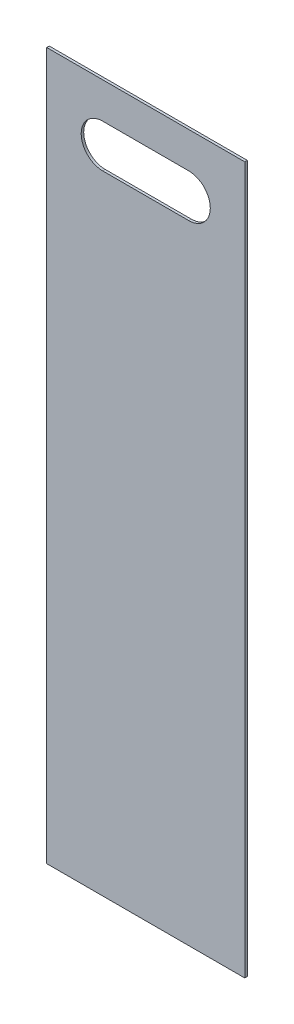
ISO-10303-21;
HEADER;
FILE_DESCRIPTION(('STEP AP214'),'2;1');
FILE_NAME('part.step','',(''),(''),'','','');
FILE_SCHEMA(('AUTOMOTIVE_DESIGN { 1 0 10303 214 1 1 1 1 }'));
ENDSEC;
DATA;
#1=APPLICATION_CONTEXT('core data for automotive mechanical design processes');
#2=APPLICATION_PROTOCOL_DEFINITION('international standard','automotive_design',2000,#1);
#3=PRODUCT_CONTEXT('',#1,'mechanical');
#4=PRODUCT('Part','Part','',(#3));
#5=PRODUCT_RELATED_PRODUCT_CATEGORY('part','',(#4));
#6=PRODUCT_DEFINITION_FORMATION('','',#4);
#7=PRODUCT_DEFINITION_CONTEXT('part definition',#1,'design');
#8=PRODUCT_DEFINITION('design','',#6,#7);
#9=PRODUCT_DEFINITION_SHAPE('','',#8);
#10=(LENGTH_UNIT() NAMED_UNIT(*) SI_UNIT(.MILLI.,.METRE.));
#11=(NAMED_UNIT(*) PLANE_ANGLE_UNIT() SI_UNIT($,.RADIAN.));
#12=(NAMED_UNIT(*) SI_UNIT($,.STERADIAN.) SOLID_ANGLE_UNIT());
#13=UNCERTAINTY_MEASURE_WITH_UNIT(LENGTH_MEASURE(1.E-05),#10,'distance_accuracy_value','');
#14=(GEOMETRIC_REPRESENTATION_CONTEXT(3) GLOBAL_UNCERTAINTY_ASSIGNED_CONTEXT((#13)) GLOBAL_UNIT_ASSIGNED_CONTEXT((#10,
#11,#12)) REPRESENTATION_CONTEXT('',''));
#15=CARTESIAN_POINT('',(0.,0.,0.));
#16=DIRECTION('',(0.,0.,1.));
#17=DIRECTION('',(1.,0.,0.));
#18=AXIS2_PLACEMENT_3D('',#15,#16,#17);
#19=CARTESIAN_POINT('',(0.,0.,0.2794));
#20=DIRECTION('',(0.,0.,-1.));
#21=DIRECTION('',(-1.,0.,0.));
#22=AXIS2_PLACEMENT_3D('',#19,#20,#21);
#23=PLANE('',#22);
#24=DIRECTION('',(0.,-1.,0.));
#25=VECTOR('',#24,1.);
#26=CARTESIAN_POINT('',(-10.9601,32.766,0.2794));
#27=LINE('',#26,#25);
#28=CARTESIAN_POINT('',(-10.9601,45.466,0.2794));
#29=VERTEX_POINT('',#28);
#30=CARTESIAN_POINT('',(-10.9601,-32.766,0.2794));
#31=VERTEX_POINT('',#30);
#32=EDGE_CURVE('E153',#29,#31,#27,.T.);
#33=ORIENTED_EDGE('',*,*,#32,.T.);
#34=DIRECTION('',(1.,0.,0.));
#35=VECTOR('',#34,1.);
#36=CARTESIAN_POINT('',(10.9601,-32.766,0.2794));
#37=LINE('',#36,#35);
#38=CARTESIAN_POINT('',(10.9601,-32.766,0.2794));
#39=VERTEX_POINT('',#38);
#40=EDGE_CURVE('E157',#31,#39,#37,.T.);
#41=ORIENTED_EDGE('',*,*,#40,.T.);
#42=DIRECTION('',(0.,1.,0.));
#43=VECTOR('',#42,1.);
#44=CARTESIAN_POINT('',(10.9601,32.766,0.2794));
#45=LINE('',#44,#43);
#46=CARTESIAN_POINT('',(10.9601,45.466,0.2794));
#47=VERTEX_POINT('',#46);
#48=EDGE_CURVE('E161',#39,#47,#45,.T.);
#49=ORIENTED_EDGE('',*,*,#48,.T.);
#50=DIRECTION('',(-1.,0.,0.));
#51=VECTOR('',#50,1.);
#52=CARTESIAN_POINT('',(-10.9601,45.466,0.2794));
#53=LINE('',#52,#51);
#54=EDGE_CURVE('E164',#47,#29,#53,.T.);
#55=ORIENTED_EDGE('',*,*,#54,.T.);
#56=EDGE_LOOP('',(#33,#41,#49,#55));
#57=FACE_BOUND('',#56,.T.);
#58=CARTESIAN_POINT('',(4.7625,39.116,0.2794));
#59=DIRECTION('',(0.,0.,1.));
#60=DIRECTION('',(1.,0.,0.));
#61=AXIS2_PLACEMENT_3D('',#58,#59,#60);
#62=CIRCLE('',#61,2.38125);
#63=CARTESIAN_POINT('',(4.7625,36.73475,0.2794));
#64=VERTEX_POINT('',#63);
#65=CARTESIAN_POINT('',(4.7625,41.49725,0.2794));
#66=VERTEX_POINT('',#65);
#67=EDGE_CURVE('E105',#64,#66,#62,.T.);
#68=ORIENTED_EDGE('',*,*,#67,.F.);
#69=DIRECTION('',(1.,0.,0.));
#70=VECTOR('',#69,1.);
#71=CARTESIAN_POINT('',(4.7625,36.73475,0.2794));
#72=LINE('',#71,#70);
#73=CARTESIAN_POINT('',(-4.7625,36.73475,0.2794));
#74=VERTEX_POINT('',#73);
#75=EDGE_CURVE('E131',#74,#64,#72,.T.);
#76=ORIENTED_EDGE('',*,*,#75,.F.);
#77=CARTESIAN_POINT('',(-4.7625,39.116,0.2794));
#78=DIRECTION('',(0.,0.,1.));
#79=DIRECTION('',(1.,0.,0.));
#80=AXIS2_PLACEMENT_3D('',#77,#78,#79);
#81=CIRCLE('',#80,2.38125);
#82=CARTESIAN_POINT('',(-4.7625,41.49725,0.2794));
#83=VERTEX_POINT('',#82);
#84=EDGE_CURVE('E127',#83,#74,#81,.T.);
#85=ORIENTED_EDGE('',*,*,#84,.F.);
#86=DIRECTION('',(-1.,0.,0.));
#87=VECTOR('',#86,1.);
#88=CARTESIAN_POINT('',(4.7625,41.49725,0.2794));
#89=LINE('',#88,#87);
#90=EDGE_CURVE('E114',#66,#83,#89,.T.);
#91=ORIENTED_EDGE('',*,*,#90,.F.);
#92=EDGE_LOOP('',(#68,#76,#85,#91));
#93=FACE_BOUND('',#92,.T.);
#94=ADVANCED_FACE('F39',(#57,#93),#23,.F.);
#95=CARTESIAN_POINT('',(0.,0.,0.));
#96=DIRECTION('',(0.,0.,-1.));
#97=DIRECTION('',(-1.,0.,0.));
#98=AXIS2_PLACEMENT_3D('',#95,#96,#97);
#99=PLANE('',#98);
#100=DIRECTION('',(1.,0.,0.));
#101=VECTOR('',#100,1.);
#102=CARTESIAN_POINT('',(10.9601,-32.766,0.));
#103=LINE('',#102,#101);
#104=CARTESIAN_POINT('',(-10.9601,-32.766,0.));
#105=VERTEX_POINT('',#104);
#106=CARTESIAN_POINT('',(10.9601,-32.766,0.));
#107=VERTEX_POINT('',#106);
#108=EDGE_CURVE('E123',#105,#107,#103,.T.);
#109=ORIENTED_EDGE('',*,*,#108,.F.);
#110=DIRECTION('',(0.,-1.,0.));
#111=VECTOR('',#110,1.);
#112=CARTESIAN_POINT('',(-10.9601,32.766,0.));
#113=LINE('',#112,#111);
#114=CARTESIAN_POINT('',(-10.9601,45.466,0.));
#115=VERTEX_POINT('',#114);
#116=EDGE_CURVE('E158',#115,#105,#113,.T.);
#117=ORIENTED_EDGE('',*,*,#116,.F.);
#118=DIRECTION('',(-1.,0.,0.));
#119=VECTOR('',#118,1.);
#120=CARTESIAN_POINT('',(-10.9601,45.466,0.));
#121=LINE('',#120,#119);
#122=CARTESIAN_POINT('',(10.9601,45.466,0.));
#123=VERTEX_POINT('',#122);
#124=EDGE_CURVE('E175',#123,#115,#121,.T.);
#125=ORIENTED_EDGE('',*,*,#124,.F.);
#126=DIRECTION('',(0.,1.,0.));
#127=VECTOR('',#126,1.);
#128=CARTESIAN_POINT('',(10.9601,45.466,0.));
#129=LINE('',#128,#127);
#130=EDGE_CURVE('E172',#107,#123,#129,.T.);
#131=ORIENTED_EDGE('',*,*,#130,.F.);
#132=EDGE_LOOP('',(#109,#117,#125,#131));
#133=FACE_BOUND('',#132,.T.);
#134=DIRECTION('',(1.,0.,0.));
#135=VECTOR('',#134,1.);
#136=CARTESIAN_POINT('',(4.7625,36.73475,0.));
#137=LINE('',#136,#135);
#138=CARTESIAN_POINT('',(-4.7625,36.73475,0.));
#139=VERTEX_POINT('',#138);
#140=CARTESIAN_POINT('',(4.7625,36.73475,0.));
#141=VERTEX_POINT('',#140);
#142=EDGE_CURVE('E115',#139,#141,#137,.T.);
#143=ORIENTED_EDGE('',*,*,#142,.T.);
#144=CARTESIAN_POINT('',(4.7625,39.116,0.));
#145=DIRECTION('',(0.,0.,1.));
#146=DIRECTION('',(1.,0.,0.));
#147=AXIS2_PLACEMENT_3D('',#144,#145,#146);
#148=CIRCLE('',#147,2.38125);
#149=CARTESIAN_POINT('',(4.7625,41.49725,0.));
#150=VERTEX_POINT('',#149);
#151=EDGE_CURVE('E63',#141,#150,#148,.T.);
#152=ORIENTED_EDGE('',*,*,#151,.T.);
#153=DIRECTION('',(-1.,0.,0.));
#154=VECTOR('',#153,1.);
#155=CARTESIAN_POINT('',(4.7625,41.49725,0.));
#156=LINE('',#155,#154);
#157=CARTESIAN_POINT('',(-4.7625,41.49725,0.));
#158=VERTEX_POINT('',#157);
#159=EDGE_CURVE('E121',#150,#158,#156,.T.);
#160=ORIENTED_EDGE('',*,*,#159,.T.);
#161=CARTESIAN_POINT('',(-4.7625,39.116,0.));
#162=DIRECTION('',(0.,0.,1.));
#163=DIRECTION('',(1.,0.,0.));
#164=AXIS2_PLACEMENT_3D('',#161,#162,#163);
#165=CIRCLE('',#164,2.38125);
#166=EDGE_CURVE('E140',#158,#139,#165,.T.);
#167=ORIENTED_EDGE('',*,*,#166,.T.);
#168=EDGE_LOOP('',(#143,#152,#160,#167));
#169=FACE_BOUND('',#168,.T.);
#170=ADVANCED_FACE('F198',(#133,#169),#99,.T.);
#171=CARTESIAN_POINT('',(10.9601,-32.766,0.2794));
#172=DIRECTION('',(0.,1.,0.));
#173=DIRECTION('',(-1.,0.,0.));
#174=AXIS2_PLACEMENT_3D('',#171,#172,#173);
#175=PLANE('',#174);
#176=ORIENTED_EDGE('',*,*,#108,.T.);
#177=DIRECTION('',(0.,0.,-1.));
#178=VECTOR('',#177,1.);
#179=CARTESIAN_POINT('',(10.9601,-32.766,0.2794));
#180=LINE('',#179,#178);
#181=EDGE_CURVE('E48',#39,#107,#180,.T.);
#182=ORIENTED_EDGE('',*,*,#181,.F.);
#183=ORIENTED_EDGE('',*,*,#40,.F.);
#184=DIRECTION('',(0.,0.,-1.));
#185=VECTOR('',#184,1.);
#186=CARTESIAN_POINT('',(-10.9601,-32.766,0.2794));
#187=LINE('',#186,#185);
#188=EDGE_CURVE('E11',#31,#105,#187,.T.);
#189=ORIENTED_EDGE('',*,*,#188,.T.);
#190=EDGE_LOOP('',(#176,#182,#183,#189));
#191=FACE_BOUND('',#190,.T.);
#192=ADVANCED_FACE('F41',(#191),#175,.F.);
#193=CARTESIAN_POINT('',(10.9601,45.466,0.2794));
#194=DIRECTION('',(-1.,0.,0.));
#195=DIRECTION('',(0.,-1.,0.));
#196=AXIS2_PLACEMENT_3D('',#193,#194,#195);
#197=PLANE('',#196);
#198=ORIENTED_EDGE('',*,*,#130,.T.);
#199=DIRECTION('',(0.,0.,-1.));
#200=VECTOR('',#199,1.);
#201=CARTESIAN_POINT('',(10.9601,45.466,0.2794));
#202=LINE('',#201,#200);
#203=EDGE_CURVE('E183',#47,#123,#202,.T.);
#204=ORIENTED_EDGE('',*,*,#203,.F.);
#205=ORIENTED_EDGE('',*,*,#48,.F.);
#206=ORIENTED_EDGE('',*,*,#181,.T.);
#207=EDGE_LOOP('',(#198,#204,#205,#206));
#208=FACE_BOUND('',#207,.T.);
#209=ADVANCED_FACE('F191',(#208),#197,.F.);
#210=CARTESIAN_POINT('',(-10.9601,45.466,0.2794));
#211=DIRECTION('',(0.,-1.,0.));
#212=DIRECTION('',(0.,0.,-1.));
#213=AXIS2_PLACEMENT_3D('',#210,#211,#212);
#214=PLANE('',#213);
#215=ORIENTED_EDGE('',*,*,#124,.T.);
#216=DIRECTION('',(0.,0.,-1.));
#217=VECTOR('',#216,1.);
#218=CARTESIAN_POINT('',(-10.9601,45.466,0.2794));
#219=LINE('',#218,#217);
#220=EDGE_CURVE('E168',#29,#115,#219,.T.);
#221=ORIENTED_EDGE('',*,*,#220,.F.);
#222=ORIENTED_EDGE('',*,*,#54,.F.);
#223=ORIENTED_EDGE('',*,*,#203,.T.);
#224=EDGE_LOOP('',(#215,#221,#222,#223));
#225=FACE_BOUND('',#224,.T.);
#226=ADVANCED_FACE('F203',(#225),#214,.F.);
#227=CARTESIAN_POINT('',(-10.9601,32.766,0.2794));
#228=DIRECTION('',(1.,0.,0.));
#229=DIRECTION('',(0.,0.,-1.));
#230=AXIS2_PLACEMENT_3D('',#227,#228,#229);
#231=PLANE('',#230);
#232=ORIENTED_EDGE('',*,*,#116,.T.);
#233=ORIENTED_EDGE('',*,*,#188,.F.);
#234=ORIENTED_EDGE('',*,*,#32,.F.);
#235=ORIENTED_EDGE('',*,*,#220,.T.);
#236=EDGE_LOOP('',(#232,#233,#234,#235));
#237=FACE_BOUND('',#236,.T.);
#238=ADVANCED_FACE('F206',(#237),#231,.F.);
#239=CARTESIAN_POINT('',(4.7625,39.116,0.2794));
#240=DIRECTION('',(0.,0.,-1.));
#241=DIRECTION('',(-1.,0.,0.));
#242=AXIS2_PLACEMENT_3D('',#239,#240,#241);
#243=CYLINDRICAL_SURFACE('',#242,2.38125);
#244=ORIENTED_EDGE('',*,*,#151,.F.);
#245=DIRECTION('',(0.,0.,-1.));
#246=VECTOR('',#245,1.);
#247=CARTESIAN_POINT('',(4.7625,36.73475,0.2794));
#248=LINE('',#247,#246);
#249=EDGE_CURVE('E109',#64,#141,#248,.T.);
#250=ORIENTED_EDGE('',*,*,#249,.F.);
#251=ORIENTED_EDGE('',*,*,#67,.T.);
#252=DIRECTION('',(0.,0.,-1.));
#253=VECTOR('',#252,1.);
#254=CARTESIAN_POINT('',(4.7625,41.49725,0.2794));
#255=LINE('',#254,#253);
#256=EDGE_CURVE('E108',#66,#150,#255,.T.);
#257=ORIENTED_EDGE('',*,*,#256,.T.);
#258=EDGE_LOOP('',(#244,#250,#251,#257));
#259=FACE_BOUND('',#258,.T.);
#260=ADVANCED_FACE('F107',(#259),#243,.F.);
#261=CARTESIAN_POINT('',(4.7625,41.49725,0.2794));
#262=DIRECTION('',(0.,-1.,0.));
#263=DIRECTION('',(0.,0.,-1.));
#264=AXIS2_PLACEMENT_3D('',#261,#262,#263);
#265=PLANE('',#264);
#266=ORIENTED_EDGE('',*,*,#159,.F.);
#267=ORIENTED_EDGE('',*,*,#256,.F.);
#268=ORIENTED_EDGE('',*,*,#90,.T.);
#269=DIRECTION('',(0.,0.,-1.));
#270=VECTOR('',#269,1.);
#271=CARTESIAN_POINT('',(-4.7625,41.49725,0.2794));
#272=LINE('',#271,#270);
#273=EDGE_CURVE('E124',#83,#158,#272,.T.);
#274=ORIENTED_EDGE('',*,*,#273,.T.);
#275=EDGE_LOOP('',(#266,#267,#268,#274));
#276=FACE_BOUND('',#275,.T.);
#277=ADVANCED_FACE('F118',(#276),#265,.T.);
#278=CARTESIAN_POINT('',(-4.7625,39.116,0.2794));
#279=DIRECTION('',(0.,0.,-1.));
#280=DIRECTION('',(-1.,0.,0.));
#281=AXIS2_PLACEMENT_3D('',#278,#279,#280);
#282=CYLINDRICAL_SURFACE('',#281,2.38125);
#283=ORIENTED_EDGE('',*,*,#166,.F.);
#284=ORIENTED_EDGE('',*,*,#273,.F.);
#285=ORIENTED_EDGE('',*,*,#84,.T.);
#286=DIRECTION('',(0.,0.,-1.));
#287=VECTOR('',#286,1.);
#288=CARTESIAN_POINT('',(-4.7625,36.73475,0.2794));
#289=LINE('',#288,#287);
#290=EDGE_CURVE('E55',#74,#139,#289,.T.);
#291=ORIENTED_EDGE('',*,*,#290,.T.);
#292=EDGE_LOOP('',(#283,#284,#285,#291));
#293=FACE_BOUND('',#292,.T.);
#294=ADVANCED_FACE('F272',(#293),#282,.F.);
#295=CARTESIAN_POINT('',(4.7625,36.73475,0.2794));
#296=DIRECTION('',(0.,1.,0.));
#297=DIRECTION('',(0.,0.,1.));
#298=AXIS2_PLACEMENT_3D('',#295,#296,#297);
#299=PLANE('',#298);
#300=ORIENTED_EDGE('',*,*,#142,.F.);
#301=ORIENTED_EDGE('',*,*,#290,.F.);
#302=ORIENTED_EDGE('',*,*,#75,.T.);
#303=ORIENTED_EDGE('',*,*,#249,.T.);
#304=EDGE_LOOP('',(#300,#301,#302,#303));
#305=FACE_BOUND('',#304,.T.);
#306=ADVANCED_FACE('F279',(#305),#299,.T.);
#307=CLOSED_SHELL('',(#94,#170,#192,#209,#226,#238,#260,#277,#294,#306));
#308=MANIFOLD_SOLID_BREP('B2',#307);
#309=ADVANCED_BREP_SHAPE_REPRESENTATION('',(#18,#308),#14);
#310=SHAPE_DEFINITION_REPRESENTATION(#9,#309);
ENDSEC;
END-ISO-10303-21;
